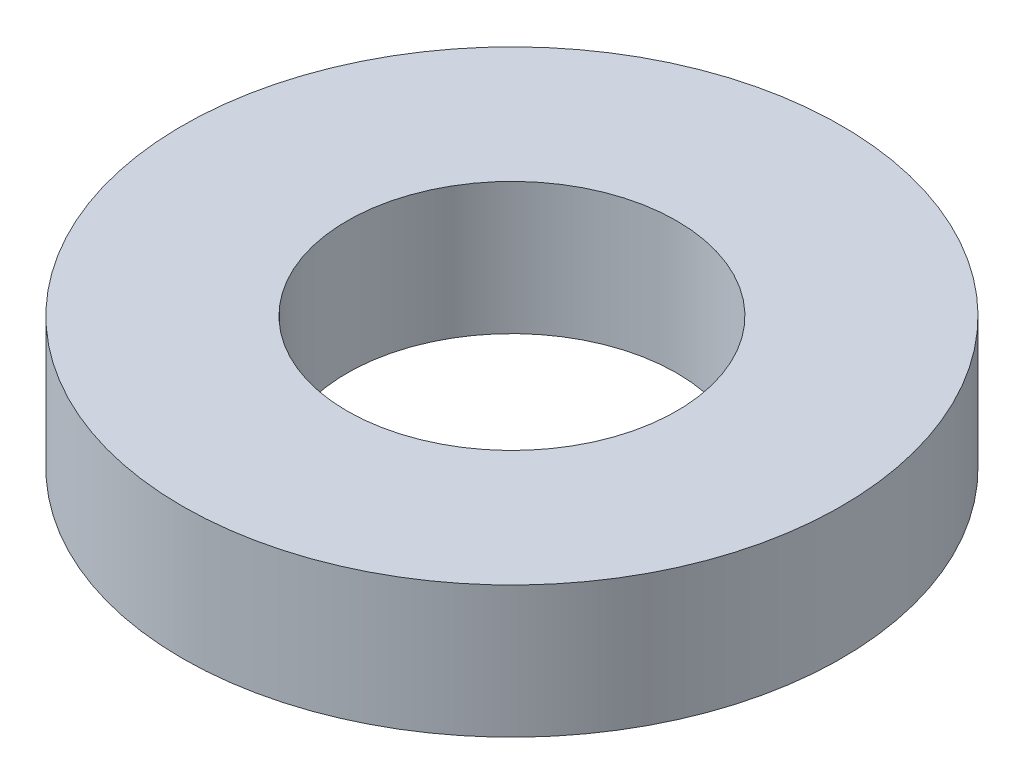
ISO-10303-21;
HEADER;
FILE_DESCRIPTION(('STEP AP214'),'2;1');
FILE_NAME('part.step','',(''),(''),'','','');
FILE_SCHEMA(('AUTOMOTIVE_DESIGN { 1 0 10303 214 1 1 1 1 }'));
ENDSEC;
DATA;
#1=APPLICATION_CONTEXT('core data for automotive mechanical design processes');
#2=APPLICATION_PROTOCOL_DEFINITION('international standard','automotive_design',2000,#1);
#3=PRODUCT_CONTEXT('',#1,'mechanical');
#4=PRODUCT('Part','Part','',(#3));
#5=PRODUCT_RELATED_PRODUCT_CATEGORY('part','',(#4));
#6=PRODUCT_DEFINITION_FORMATION('','',#4);
#7=PRODUCT_DEFINITION_CONTEXT('part definition',#1,'design');
#8=PRODUCT_DEFINITION('design','',#6,#7);
#9=PRODUCT_DEFINITION_SHAPE('','',#8);
#10=(LENGTH_UNIT() NAMED_UNIT(*) SI_UNIT(.MILLI.,.METRE.));
#11=(NAMED_UNIT(*) PLANE_ANGLE_UNIT() SI_UNIT($,.RADIAN.));
#12=(NAMED_UNIT(*) SI_UNIT($,.STERADIAN.) SOLID_ANGLE_UNIT());
#13=UNCERTAINTY_MEASURE_WITH_UNIT(LENGTH_MEASURE(1.E-05),#10,'distance_accuracy_value','');
#14=(GEOMETRIC_REPRESENTATION_CONTEXT(3) GLOBAL_UNCERTAINTY_ASSIGNED_CONTEXT((#13)) GLOBAL_UNIT_ASSIGNED_CONTEXT((#10,
#11,#12)) REPRESENTATION_CONTEXT('',''));
#15=CARTESIAN_POINT('',(0.,0.,0.));
#16=DIRECTION('',(0.,0.,1.));
#17=DIRECTION('',(1.,0.,0.));
#18=AXIS2_PLACEMENT_3D('',#15,#16,#17);
#19=CARTESIAN_POINT('',(0.,10.,0.));
#20=DIRECTION('',(0.,1.,0.));
#21=DIRECTION('',(0.,0.,1.));
#22=AXIS2_PLACEMENT_3D('',#19,#20,#21);
#23=PLANE('',#22);
#24=CARTESIAN_POINT('',(0.,10.,0.));
#25=DIRECTION('',(0.,1.,0.));
#26=DIRECTION('',(0.,0.,1.));
#27=AXIS2_PLACEMENT_3D('',#24,#25,#26);
#28=CIRCLE('',#27,50.);
#29=CARTESIAN_POINT('',(0.,10.,50.));
#30=VERTEX_POINT('',#29);
#31=EDGE_CURVE('E10',#30,#30,#28,.T.);
#32=ORIENTED_EDGE('',*,*,#31,.T.);
#33=EDGE_LOOP('',(#32));
#34=FACE_BOUND('',#33,.T.);
#35=CARTESIAN_POINT('',(0.,10.,0.));
#36=DIRECTION('',(0.,1.,0.));
#37=DIRECTION('',(0.,0.,1.));
#38=AXIS2_PLACEMENT_3D('',#35,#36,#37);
#39=CIRCLE('',#38,25.);
#40=CARTESIAN_POINT('',(0.,10.,25.));
#41=VERTEX_POINT('',#40);
#42=EDGE_CURVE('E54',#41,#41,#39,.T.);
#43=ORIENTED_EDGE('',*,*,#42,.F.);
#44=EDGE_LOOP('',(#43));
#45=FACE_BOUND('',#44,.T.);
#46=ADVANCED_FACE('F41',(#34,#45),#23,.T.);
#47=CARTESIAN_POINT('',(0.,-10.,0.));
#48=DIRECTION('',(0.,1.,0.));
#49=DIRECTION('',(0.,0.,1.));
#50=AXIS2_PLACEMENT_3D('',#47,#48,#49);
#51=PLANE('',#50);
#52=CARTESIAN_POINT('',(0.,-10.,0.));
#53=DIRECTION('',(0.,1.,0.));
#54=DIRECTION('',(0.,0.,1.));
#55=AXIS2_PLACEMENT_3D('',#52,#53,#54);
#56=CIRCLE('',#55,50.);
#57=CARTESIAN_POINT('',(0.,-10.,50.));
#58=VERTEX_POINT('',#57);
#59=EDGE_CURVE('E45',#58,#58,#56,.T.);
#60=ORIENTED_EDGE('',*,*,#59,.F.);
#61=EDGE_LOOP('',(#60));
#62=FACE_BOUND('',#61,.T.);
#63=CARTESIAN_POINT('',(0.,-10.,0.));
#64=DIRECTION('',(0.,1.,0.));
#65=DIRECTION('',(0.,0.,1.));
#66=AXIS2_PLACEMENT_3D('',#63,#64,#65);
#67=CIRCLE('',#66,25.);
#68=CARTESIAN_POINT('',(0.,-10.,25.));
#69=VERTEX_POINT('',#68);
#70=EDGE_CURVE('E56',#69,#69,#67,.T.);
#71=ORIENTED_EDGE('',*,*,#70,.T.);
#72=EDGE_LOOP('',(#71));
#73=FACE_BOUND('',#72,.T.);
#74=ADVANCED_FACE('F68',(#62,#73),#51,.F.);
#75=CARTESIAN_POINT('',(0.,10.,0.));
#76=DIRECTION('',(0.,-1.,0.));
#77=DIRECTION('',(0.,0.,-1.));
#78=AXIS2_PLACEMENT_3D('',#75,#76,#77);
#79=CYLINDRICAL_SURFACE('',#78,50.);
#80=ORIENTED_EDGE('',*,*,#31,.F.);
#81=EDGE_LOOP('',(#80));
#82=FACE_BOUND('',#81,.T.);
#83=ORIENTED_EDGE('',*,*,#59,.T.);
#84=EDGE_LOOP('',(#83));
#85=FACE_BOUND('',#84,.T.);
#86=ADVANCED_FACE('F43',(#82,#85),#79,.T.);
#87=CARTESIAN_POINT('',(0.,10.,0.));
#88=DIRECTION('',(0.,-1.,0.));
#89=DIRECTION('',(0.,0.,-1.));
#90=AXIS2_PLACEMENT_3D('',#87,#88,#89);
#91=CYLINDRICAL_SURFACE('',#90,25.);
#92=ORIENTED_EDGE('',*,*,#42,.T.);
#93=EDGE_LOOP('',(#92));
#94=FACE_BOUND('',#93,.T.);
#95=ORIENTED_EDGE('',*,*,#70,.F.);
#96=EDGE_LOOP('',(#95));
#97=FACE_BOUND('',#96,.T.);
#98=ADVANCED_FACE('F64',(#94,#97),#91,.F.);
#99=CLOSED_SHELL('',(#46,#74,#86,#98));
#100=MANIFOLD_SOLID_BREP('B2',#99);
#101=ADVANCED_BREP_SHAPE_REPRESENTATION('',(#18,#100),#14);
#102=SHAPE_DEFINITION_REPRESENTATION(#9,#101);
ENDSEC;
END-ISO-10303-21;
